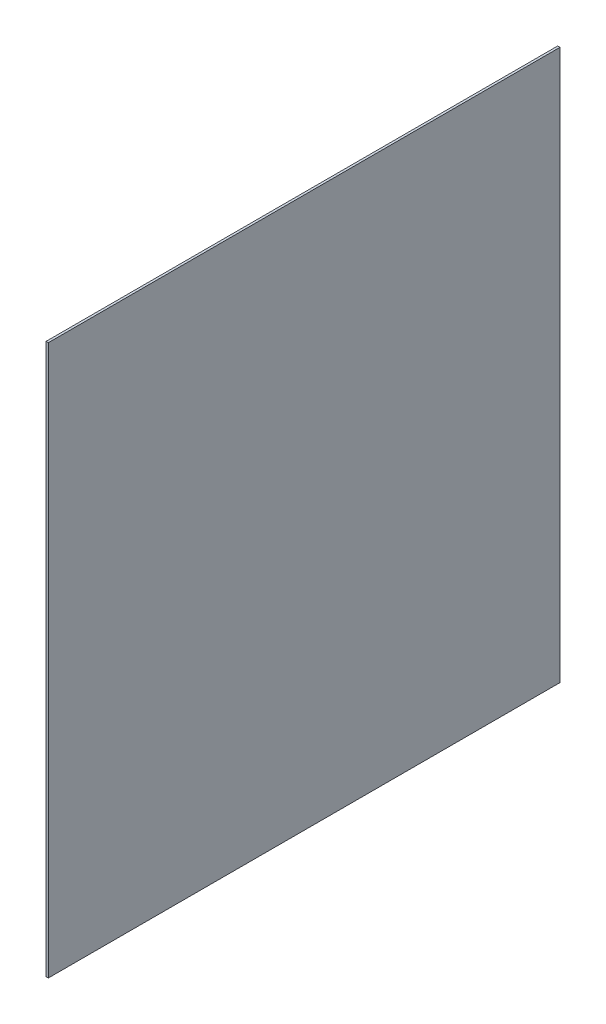
ISO-10303-21;
HEADER;
FILE_DESCRIPTION(('STEP AP214'),'2;1');
FILE_NAME('part.step','',(''),(''),'','','');
FILE_SCHEMA(('AUTOMOTIVE_DESIGN { 1 0 10303 214 1 1 1 1 }'));
ENDSEC;
DATA;
#1=APPLICATION_CONTEXT('core data for automotive mechanical design processes');
#2=APPLICATION_PROTOCOL_DEFINITION('international standard','automotive_design',2000,#1);
#3=PRODUCT_CONTEXT('',#1,'mechanical');
#4=PRODUCT('Part','Part','',(#3));
#5=PRODUCT_RELATED_PRODUCT_CATEGORY('part','',(#4));
#6=PRODUCT_DEFINITION_FORMATION('','',#4);
#7=PRODUCT_DEFINITION_CONTEXT('part definition',#1,'design');
#8=PRODUCT_DEFINITION('design','',#6,#7);
#9=PRODUCT_DEFINITION_SHAPE('','',#8);
#10=(LENGTH_UNIT() NAMED_UNIT(*) SI_UNIT(.MILLI.,.METRE.));
#11=(NAMED_UNIT(*) PLANE_ANGLE_UNIT() SI_UNIT($,.RADIAN.));
#12=(NAMED_UNIT(*) SI_UNIT($,.STERADIAN.) SOLID_ANGLE_UNIT());
#13=UNCERTAINTY_MEASURE_WITH_UNIT(LENGTH_MEASURE(1.E-05),#10,'distance_accuracy_value','');
#14=(GEOMETRIC_REPRESENTATION_CONTEXT(3) GLOBAL_UNCERTAINTY_ASSIGNED_CONTEXT((#13)) GLOBAL_UNIT_ASSIGNED_CONTEXT((#10,
#11,#12)) REPRESENTATION_CONTEXT('',''));
#15=CARTESIAN_POINT('',(0.,0.,0.));
#16=DIRECTION('',(0.,0.,1.));
#17=DIRECTION('',(1.,0.,0.));
#18=AXIS2_PLACEMENT_3D('',#15,#16,#17);
#19=CARTESIAN_POINT('',(1.58749999999995,759.46,-353.060000000002));
#20=DIRECTION('',(0.,0.,1.));
#21=DIRECTION('',(1.,0.,0.));
#22=AXIS2_PLACEMENT_3D('',#19,#20,#21);
#23=PLANE('',#22);
#24=DIRECTION('',(-1.,0.,0.));
#25=VECTOR('',#24,1.);
#26=CARTESIAN_POINT('',(1.58749999999995,0.,-353.060000000002));
#27=LINE('',#26,#25);
#28=CARTESIAN_POINT('',(1.58749999999995,0.,-353.060000000002));
#29=VERTEX_POINT('',#28);
#30=CARTESIAN_POINT('',(-1.58750000000005,0.,-353.060000000002));
#31=VERTEX_POINT('',#30);
#32=EDGE_CURVE('E96',#29,#31,#27,.T.);
#33=ORIENTED_EDGE('',*,*,#32,.T.);
#34=DIRECTION('',(0.,-1.,0.));
#35=VECTOR('',#34,1.);
#36=CARTESIAN_POINT('',(-1.58750000000005,759.46,-353.060000000002));
#37=LINE('',#36,#35);
#38=CARTESIAN_POINT('',(-1.58750000000005,759.46,-353.060000000002));
#39=VERTEX_POINT('',#38);
#40=EDGE_CURVE('E11',#39,#31,#37,.T.);
#41=ORIENTED_EDGE('',*,*,#40,.F.);
#42=DIRECTION('',(-1.,0.,0.));
#43=VECTOR('',#42,1.);
#44=CARTESIAN_POINT('',(1.58749999999995,759.46,-353.060000000002));
#45=LINE('',#44,#43);
#46=CARTESIAN_POINT('',(1.58749999999995,759.46,-353.060000000002));
#47=VERTEX_POINT('',#46);
#48=EDGE_CURVE('E82',#47,#39,#45,.T.);
#49=ORIENTED_EDGE('',*,*,#48,.F.);
#50=DIRECTION('',(0.,-1.,0.));
#51=VECTOR('',#50,1.);
#52=CARTESIAN_POINT('',(1.58749999999995,759.46,-353.060000000002));
#53=LINE('',#52,#51);
#54=EDGE_CURVE('E49',#47,#29,#53,.T.);
#55=ORIENTED_EDGE('',*,*,#54,.T.);
#56=EDGE_LOOP('',(#33,#41,#49,#55));
#57=FACE_BOUND('',#56,.T.);
#58=ADVANCED_FACE('F33',(#57),#23,.F.);
#59=CARTESIAN_POINT('',(-1.58750000000005,759.46,-353.060000000002));
#60=DIRECTION('',(1.,0.,0.));
#61=DIRECTION('',(0.,0.,-1.));
#62=AXIS2_PLACEMENT_3D('',#59,#60,#61);
#63=PLANE('',#62);
#64=DIRECTION('',(0.,0.,1.));
#65=VECTOR('',#64,1.);
#66=CARTESIAN_POINT('',(-1.58750000000005,0.,-353.060000000002));
#67=LINE('',#66,#65);
#68=CARTESIAN_POINT('',(-1.58749999999997,0.,353.059999999998));
#69=VERTEX_POINT('',#68);
#70=EDGE_CURVE('E87',#31,#69,#67,.T.);
#71=ORIENTED_EDGE('',*,*,#70,.T.);
#72=DIRECTION('',(0.,-1.,0.));
#73=VECTOR('',#72,1.);
#74=CARTESIAN_POINT('',(-1.58749999999997,759.46,353.059999999998));
#75=LINE('',#74,#73);
#76=CARTESIAN_POINT('',(-1.58749999999997,759.46,353.059999999998));
#77=VERTEX_POINT('',#76);
#78=EDGE_CURVE('E41',#77,#69,#75,.T.);
#79=ORIENTED_EDGE('',*,*,#78,.F.);
#80=DIRECTION('',(0.,0.,1.));
#81=VECTOR('',#80,1.);
#82=CARTESIAN_POINT('',(-1.58750000000005,759.46,-353.060000000002));
#83=LINE('',#82,#81);
#84=EDGE_CURVE('E74',#39,#77,#83,.T.);
#85=ORIENTED_EDGE('',*,*,#84,.F.);
#86=ORIENTED_EDGE('',*,*,#40,.T.);
#87=EDGE_LOOP('',(#71,#79,#85,#86));
#88=FACE_BOUND('',#87,.T.);
#89=ADVANCED_FACE('F86',(#88),#63,.F.);
#90=CARTESIAN_POINT('',(1.58750000000003,759.46,353.059999999998));
#91=DIRECTION('',(0.,0.,1.));
#92=DIRECTION('',(1.,0.,0.));
#93=AXIS2_PLACEMENT_3D('',#90,#91,#92);
#94=PLANE('',#93);
#95=DIRECTION('',(-1.,0.,0.));
#96=VECTOR('',#95,1.);
#97=CARTESIAN_POINT('',(1.58750000000003,0.,353.059999999998));
#98=LINE('',#97,#96);
#99=CARTESIAN_POINT('',(1.58750000000003,0.,353.059999999998));
#100=VERTEX_POINT('',#99);
#101=EDGE_CURVE('E99',#100,#69,#98,.T.);
#102=ORIENTED_EDGE('',*,*,#101,.F.);
#103=DIRECTION('',(0.,-1.,0.));
#104=VECTOR('',#103,1.);
#105=CARTESIAN_POINT('',(1.58750000000003,759.46,353.059999999998));
#106=LINE('',#105,#104);
#107=CARTESIAN_POINT('',(1.58750000000003,759.46,353.059999999998));
#108=VERTEX_POINT('',#107);
#109=EDGE_CURVE('E63',#108,#100,#106,.T.);
#110=ORIENTED_EDGE('',*,*,#109,.F.);
#111=DIRECTION('',(-1.,0.,0.));
#112=VECTOR('',#111,1.);
#113=CARTESIAN_POINT('',(1.58750000000003,759.46,353.059999999998));
#114=LINE('',#113,#112);
#115=EDGE_CURVE('E81',#108,#77,#114,.T.);
#116=ORIENTED_EDGE('',*,*,#115,.T.);
#117=ORIENTED_EDGE('',*,*,#78,.T.);
#118=EDGE_LOOP('',(#102,#110,#116,#117));
#119=FACE_BOUND('',#118,.T.);
#120=ADVANCED_FACE('F90',(#119),#94,.T.);
#121=CARTESIAN_POINT('',(1.58749999999995,759.46,-353.060000000002));
#122=DIRECTION('',(1.,0.,0.));
#123=DIRECTION('',(0.,0.,-1.));
#124=AXIS2_PLACEMENT_3D('',#121,#122,#123);
#125=PLANE('',#124);
#126=DIRECTION('',(0.,0.,1.));
#127=VECTOR('',#126,1.);
#128=CARTESIAN_POINT('',(1.58749999999995,0.,-353.060000000002));
#129=LINE('',#128,#127);
#130=EDGE_CURVE('E101',#29,#100,#129,.T.);
#131=ORIENTED_EDGE('',*,*,#130,.F.);
#132=ORIENTED_EDGE('',*,*,#54,.F.);
#133=DIRECTION('',(0.,0.,1.));
#134=VECTOR('',#133,1.);
#135=CARTESIAN_POINT('',(1.58749999999995,759.46,-353.060000000002));
#136=LINE('',#135,#134);
#137=EDGE_CURVE('E91',#47,#108,#136,.T.);
#138=ORIENTED_EDGE('',*,*,#137,.T.);
#139=ORIENTED_EDGE('',*,*,#109,.T.);
#140=EDGE_LOOP('',(#131,#132,#138,#139));
#141=FACE_BOUND('',#140,.T.);
#142=ADVANCED_FACE('F107',(#141),#125,.T.);
#143=CARTESIAN_POINT('',(0.,759.46,0.));
#144=DIRECTION('',(0.,1.,0.));
#145=DIRECTION('',(0.,0.,1.));
#146=AXIS2_PLACEMENT_3D('',#143,#144,#145);
#147=PLANE('',#146);
#148=ORIENTED_EDGE('',*,*,#48,.T.);
#149=ORIENTED_EDGE('',*,*,#84,.T.);
#150=ORIENTED_EDGE('',*,*,#115,.F.);
#151=ORIENTED_EDGE('',*,*,#137,.F.);
#152=EDGE_LOOP('',(#148,#149,#150,#151));
#153=FACE_BOUND('',#152,.T.);
#154=ADVANCED_FACE('F78',(#153),#147,.T.);
#155=CARTESIAN_POINT('',(0.,0.,0.));
#156=DIRECTION('',(0.,1.,0.));
#157=DIRECTION('',(0.,0.,1.));
#158=AXIS2_PLACEMENT_3D('',#155,#156,#157);
#159=PLANE('',#158);
#160=ORIENTED_EDGE('',*,*,#32,.F.);
#161=ORIENTED_EDGE('',*,*,#130,.T.);
#162=ORIENTED_EDGE('',*,*,#101,.T.);
#163=ORIENTED_EDGE('',*,*,#70,.F.);
#164=EDGE_LOOP('',(#160,#161,#162,#163));
#165=FACE_BOUND('',#164,.T.);
#166=ADVANCED_FACE('F106',(#165),#159,.F.);
#167=CLOSED_SHELL('',(#58,#89,#120,#142,#154,#166));
#168=MANIFOLD_SOLID_BREP('B2',#167);
#169=ADVANCED_BREP_SHAPE_REPRESENTATION('',(#18,#168),#14);
#170=SHAPE_DEFINITION_REPRESENTATION(#9,#169);
ENDSEC;
END-ISO-10303-21;
